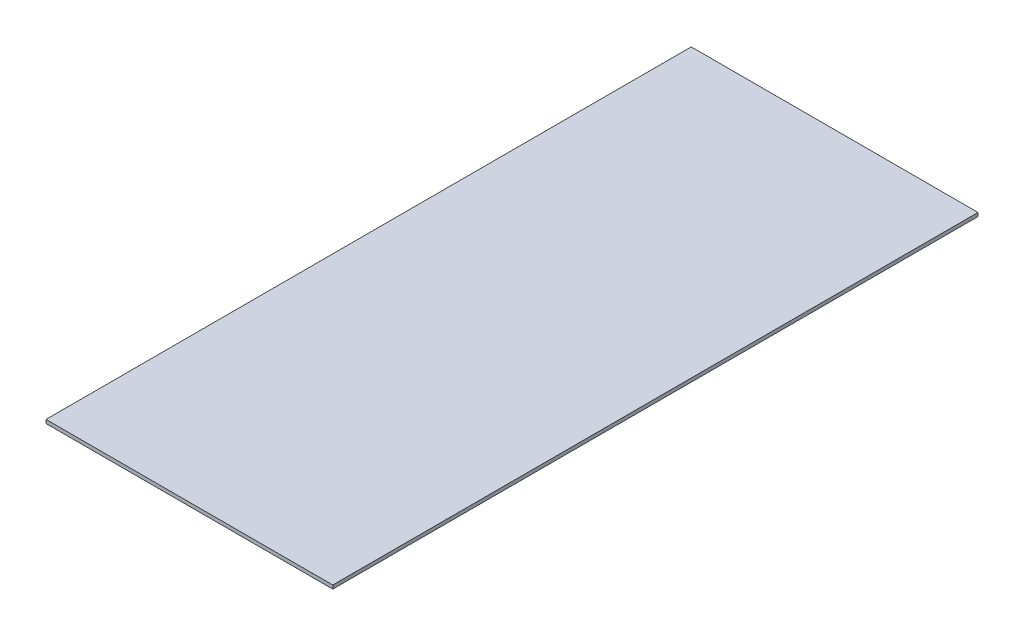
ISO-10303-21;
HEADER;
FILE_DESCRIPTION(('STEP AP214'),'2;1');
FILE_NAME('part.step','',(''),(''),'','','');
FILE_SCHEMA(('AUTOMOTIVE_DESIGN { 1 0 10303 214 1 1 1 1 }'));
ENDSEC;
DATA;
#1=APPLICATION_CONTEXT('core data for automotive mechanical design processes');
#2=APPLICATION_PROTOCOL_DEFINITION('international standard','automotive_design',2000,#1);
#3=PRODUCT_CONTEXT('',#1,'mechanical');
#4=PRODUCT('Part','Part','',(#3));
#5=PRODUCT_RELATED_PRODUCT_CATEGORY('part','',(#4));
#6=PRODUCT_DEFINITION_FORMATION('','',#4);
#7=PRODUCT_DEFINITION_CONTEXT('part definition',#1,'design');
#8=PRODUCT_DEFINITION('design','',#6,#7);
#9=PRODUCT_DEFINITION_SHAPE('','',#8);
#10=(LENGTH_UNIT() NAMED_UNIT(*) SI_UNIT(.MILLI.,.METRE.));
#11=(NAMED_UNIT(*) PLANE_ANGLE_UNIT() SI_UNIT($,.RADIAN.));
#12=(NAMED_UNIT(*) SI_UNIT($,.STERADIAN.) SOLID_ANGLE_UNIT());
#13=UNCERTAINTY_MEASURE_WITH_UNIT(LENGTH_MEASURE(1.E-05),#10,'distance_accuracy_value','');
#14=(GEOMETRIC_REPRESENTATION_CONTEXT(3) GLOBAL_UNCERTAINTY_ASSIGNED_CONTEXT((#13)) GLOBAL_UNIT_ASSIGNED_CONTEXT((#10,
#11,#12)) REPRESENTATION_CONTEXT('',''));
#15=CARTESIAN_POINT('',(0.,0.,0.));
#16=DIRECTION('',(0.,0.,1.));
#17=DIRECTION('',(1.,0.,0.));
#18=AXIS2_PLACEMENT_3D('',#15,#16,#17);
#19=CARTESIAN_POINT('',(254.,6.35,-571.5));
#20=DIRECTION('',(0.,1.,0.));
#21=DIRECTION('',(0.,0.,1.));
#22=AXIS2_PLACEMENT_3D('',#19,#20,#21);
#23=PLANE('',#22);
#24=DIRECTION('',(1.,0.,0.));
#25=VECTOR('',#24,1.);
#26=CARTESIAN_POINT('',(0.,6.35,-571.5));
#27=LINE('',#26,#25);
#28=CARTESIAN_POINT('',(254.,6.35,-571.5));
#29=VERTEX_POINT('',#28);
#30=CARTESIAN_POINT('',(-254.,6.35,-571.5));
#31=VERTEX_POINT('',#30);
#32=EDGE_CURVE('P0_E73',#29,#31,#27,.F.);
#33=ORIENTED_EDGE('',*,*,#32,.T.);
#34=DIRECTION('',(0.,0.,1.));
#35=VECTOR('',#34,1.);
#36=CARTESIAN_POINT('',(-254.,6.35,-571.5));
#37=LINE('',#36,#35);
#38=CARTESIAN_POINT('',(-254.,6.35,571.5));
#39=VERTEX_POINT('',#38);
#40=EDGE_CURVE('P0_E77',#39,#31,#37,.F.);
#41=ORIENTED_EDGE('',*,*,#40,.F.);
#42=DIRECTION('',(1.,0.,0.));
#43=VECTOR('',#42,1.);
#44=CARTESIAN_POINT('',(0.,6.35,571.5));
#45=LINE('',#44,#43);
#46=CARTESIAN_POINT('',(254.,6.35,571.5));
#47=VERTEX_POINT('',#46);
#48=EDGE_CURVE('P0_E104',#47,#39,#45,.F.);
#49=ORIENTED_EDGE('',*,*,#48,.F.);
#50=DIRECTION('',(0.,0.,-1.));
#51=VECTOR('',#50,1.);
#52=CARTESIAN_POINT('',(254.,6.35,-571.5));
#53=LINE('',#52,#51);
#54=EDGE_CURVE('P0_E85',#29,#47,#53,.F.);
#55=ORIENTED_EDGE('',*,*,#54,.F.);
#56=EDGE_LOOP('',(#33,#41,#49,#55));
#57=FACE_BOUND('',#56,.T.);
#58=ADVANCED_FACE('P0_F35',(#57),#23,.T.);
#59=CARTESIAN_POINT('',(0.,0.,-571.5));
#60=DIRECTION('',(0.,0.,1.));
#61=DIRECTION('',(1.,0.,0.));
#62=AXIS2_PLACEMENT_3D('',#59,#60,#61);
#63=PLANE('',#62);
#64=DIRECTION('',(0.,1.,0.));
#65=VECTOR('',#64,1.);
#66=CARTESIAN_POINT('',(-254.,0.,-571.5));
#67=LINE('',#66,#65);
#68=CARTESIAN_POINT('',(-254.,0.,-571.5));
#69=VERTEX_POINT('',#68);
#70=EDGE_CURVE('P0_E79',#31,#69,#67,.F.);
#71=ORIENTED_EDGE('',*,*,#70,.F.);
#72=ORIENTED_EDGE('',*,*,#32,.F.);
#73=DIRECTION('',(0.,1.,0.));
#74=VECTOR('',#73,1.);
#75=CARTESIAN_POINT('',(254.,0.,-571.5));
#76=LINE('',#75,#74);
#77=CARTESIAN_POINT('',(254.,0.,-571.5));
#78=VERTEX_POINT('',#77);
#79=EDGE_CURVE('P0_E90',#78,#29,#76,.T.);
#80=ORIENTED_EDGE('',*,*,#79,.F.);
#81=DIRECTION('',(1.,0.,0.));
#82=VECTOR('',#81,1.);
#83=CARTESIAN_POINT('',(-254.,0.,-571.5));
#84=LINE('',#83,#82);
#85=EDGE_CURVE('P0_E89',#69,#78,#84,.T.);
#86=ORIENTED_EDGE('',*,*,#85,.F.);
#87=EDGE_LOOP('',(#71,#72,#80,#86));
#88=FACE_BOUND('',#87,.T.);
#89=ADVANCED_FACE('P0_F87',(#88),#63,.F.);
#90=CARTESIAN_POINT('',(254.,0.,-571.5));
#91=DIRECTION('',(1.,0.,0.));
#92=DIRECTION('',(0.,0.,-1.));
#93=AXIS2_PLACEMENT_3D('',#90,#91,#92);
#94=PLANE('',#93);
#95=DIRECTION('',(0.,1.,0.));
#96=VECTOR('',#95,1.);
#97=CARTESIAN_POINT('',(254.,0.,571.5));
#98=LINE('',#97,#96);
#99=CARTESIAN_POINT('',(254.,0.,571.5));
#100=VERTEX_POINT('',#99);
#101=EDGE_CURVE('P0_E106',#100,#47,#98,.T.);
#102=ORIENTED_EDGE('',*,*,#101,.F.);
#103=DIRECTION('',(0.,0.,-1.));
#104=VECTOR('',#103,1.);
#105=CARTESIAN_POINT('',(254.,0.,-571.5));
#106=LINE('',#105,#104);
#107=EDGE_CURVE('P0_E44',#78,#100,#106,.F.);
#108=ORIENTED_EDGE('',*,*,#107,.F.);
#109=ORIENTED_EDGE('',*,*,#79,.T.);
#110=ORIENTED_EDGE('',*,*,#54,.T.);
#111=EDGE_LOOP('',(#102,#108,#109,#110));
#112=FACE_BOUND('',#111,.T.);
#113=ADVANCED_FACE('P0_F134',(#112),#94,.T.);
#114=CARTESIAN_POINT('',(0.,0.,571.5));
#115=DIRECTION('',(0.,0.,1.));
#116=DIRECTION('',(1.,0.,0.));
#117=AXIS2_PLACEMENT_3D('',#114,#115,#116);
#118=PLANE('',#117);
#119=ORIENTED_EDGE('',*,*,#48,.T.);
#120=DIRECTION('',(0.,1.,0.));
#121=VECTOR('',#120,1.);
#122=CARTESIAN_POINT('',(-254.,6.35,571.5));
#123=LINE('',#122,#121);
#124=CARTESIAN_POINT('',(-254.,0.,571.5));
#125=VERTEX_POINT('',#124);
#126=EDGE_CURVE('P0_E81',#125,#39,#123,.T.);
#127=ORIENTED_EDGE('',*,*,#126,.F.);
#128=DIRECTION('',(1.,0.,0.));
#129=VECTOR('',#128,1.);
#130=CARTESIAN_POINT('',(-254.,0.,571.5));
#131=LINE('',#130,#129);
#132=EDGE_CURVE('P0_E11',#100,#125,#131,.F.);
#133=ORIENTED_EDGE('',*,*,#132,.F.);
#134=ORIENTED_EDGE('',*,*,#101,.T.);
#135=EDGE_LOOP('',(#119,#127,#133,#134));
#136=FACE_BOUND('',#135,.T.);
#137=ADVANCED_FACE('P0_F129',(#136),#118,.T.);
#138=CARTESIAN_POINT('',(-254.,6.35,-571.5));
#139=DIRECTION('',(-1.,0.,0.));
#140=DIRECTION('',(0.,0.,1.));
#141=AXIS2_PLACEMENT_3D('',#138,#139,#140);
#142=PLANE('',#141);
#143=ORIENTED_EDGE('',*,*,#126,.T.);
#144=ORIENTED_EDGE('',*,*,#40,.T.);
#145=ORIENTED_EDGE('',*,*,#70,.T.);
#146=DIRECTION('',(0.,0.,-1.));
#147=VECTOR('',#146,1.);
#148=CARTESIAN_POINT('',(-254.,0.,-571.5));
#149=LINE('',#148,#147);
#150=EDGE_CURVE('P0_E53',#125,#69,#149,.T.);
#151=ORIENTED_EDGE('',*,*,#150,.F.);
#152=EDGE_LOOP('',(#143,#144,#145,#151));
#153=FACE_BOUND('',#152,.T.);
#154=ADVANCED_FACE('P0_F78',(#153),#142,.T.);
#155=CARTESIAN_POINT('',(-254.,0.,-571.5));
#156=DIRECTION('',(0.,-1.,0.));
#157=DIRECTION('',(0.,0.,-1.));
#158=AXIS2_PLACEMENT_3D('',#155,#156,#157);
#159=PLANE('',#158);
#160=ORIENTED_EDGE('',*,*,#132,.T.);
#161=ORIENTED_EDGE('',*,*,#150,.T.);
#162=ORIENTED_EDGE('',*,*,#85,.T.);
#163=ORIENTED_EDGE('',*,*,#107,.T.);
#164=EDGE_LOOP('',(#160,#161,#162,#163));
#165=FACE_BOUND('',#164,.T.);
#166=ADVANCED_FACE('P0_F127',(#165),#159,.T.);
#167=CLOSED_SHELL('',(#58,#89,#113,#137,#154,#166));
#168=MANIFOLD_SOLID_BREP('P0_B2',#167);
#169=CARTESIAN_POINT('',(-180.975,-1.63080957782746,203.2));
#170=DIRECTION('',(0.,1.,0.));
#171=DIRECTION('',(0.,0.,1.));
#172=AXIS2_PLACEMENT_3D('',#169,#170,#171);
#173=CYLINDRICAL_SURFACE('',#172,3.175);
#174=CARTESIAN_POINT('',(-180.975,0.,203.2));
#175=DIRECTION('',(0.,1.,0.));
#176=DIRECTION('',(0.,0.,1.));
#177=AXIS2_PLACEMENT_3D('',#174,#175,#176);
#178=CIRCLE('',#177,3.175);
#179=CARTESIAN_POINT('',(-180.975,0.,206.375));
#180=VERTEX_POINT('',#179);
#181=EDGE_CURVE('P1_E10',#180,#180,#178,.T.);
#182=ORIENTED_EDGE('',*,*,#181,.T.);
#183=EDGE_LOOP('',(#182));
#184=FACE_BOUND('',#183,.T.);
#185=CARTESIAN_POINT('',(-180.975,2.59531255567134,203.2));
#186=DIRECTION('',(0.,1.,0.));
#187=DIRECTION('',(0.,0.,1.));
#188=AXIS2_PLACEMENT_3D('',#185,#186,#187);
#189=CIRCLE('',#188,3.175);
#190=CARTESIAN_POINT('',(-180.975,2.59531255567134,206.375));
#191=VERTEX_POINT('',#190);
#192=EDGE_CURVE('P1_E19',#191,#191,#189,.F.);
#193=ORIENTED_EDGE('',*,*,#192,.T.);
#194=EDGE_LOOP('',(#193));
#195=FACE_BOUND('',#194,.T.);
#196=ADVANCED_FACE('P1_F14',(#184,#195),#173,.T.);
#197=OPEN_SHELL('',(#196));
#198=SHELL_BASED_SURFACE_MODEL('P1_B1',(#197));
#199=CARTESIAN_POINT('',(-180.975,-1.63080957782746,-241.3));
#200=DIRECTION('',(0.,1.,0.));
#201=DIRECTION('',(0.,0.,1.));
#202=AXIS2_PLACEMENT_3D('',#199,#200,#201);
#203=CYLINDRICAL_SURFACE('',#202,3.175);
#204=CARTESIAN_POINT('',(-180.975,0.,-241.3));
#205=DIRECTION('',(0.,1.,0.));
#206=DIRECTION('',(0.,0.,1.));
#207=AXIS2_PLACEMENT_3D('',#204,#205,#206);
#208=CIRCLE('',#207,3.175);
#209=CARTESIAN_POINT('',(-180.975,0.,-238.125));
#210=VERTEX_POINT('',#209);
#211=EDGE_CURVE('P2_E10',#210,#210,#208,.T.);
#212=ORIENTED_EDGE('',*,*,#211,.T.);
#213=EDGE_LOOP('',(#212));
#214=FACE_BOUND('',#213,.T.);
#215=CARTESIAN_POINT('',(-180.975,2.59531255567134,-241.3));
#216=DIRECTION('',(0.,1.,0.));
#217=DIRECTION('',(0.,0.,1.));
#218=AXIS2_PLACEMENT_3D('',#215,#216,#217);
#219=CIRCLE('',#218,3.175);
#220=CARTESIAN_POINT('',(-180.975,2.59531255567134,-238.125));
#221=VERTEX_POINT('',#220);
#222=EDGE_CURVE('P2_E19',#221,#221,#219,.F.);
#223=ORIENTED_EDGE('',*,*,#222,.T.);
#224=EDGE_LOOP('',(#223));
#225=FACE_BOUND('',#224,.T.);
#226=ADVANCED_FACE('P2_F14',(#214,#225),#203,.T.);
#227=OPEN_SHELL('',(#226));
#228=SHELL_BASED_SURFACE_MODEL('P2_B1',(#227));
#229=CARTESIAN_POINT('',(146.05,-1.63080957782746,530.225));
#230=DIRECTION('',(0.,1.,0.));
#231=DIRECTION('',(0.,0.,1.));
#232=AXIS2_PLACEMENT_3D('',#229,#230,#231);
#233=CYLINDRICAL_SURFACE('',#232,3.175);
#234=CARTESIAN_POINT('',(146.05,0.,530.225));
#235=DIRECTION('',(0.,1.,0.));
#236=DIRECTION('',(0.,0.,1.));
#237=AXIS2_PLACEMENT_3D('',#234,#235,#236);
#238=CIRCLE('',#237,3.175);
#239=CARTESIAN_POINT('',(146.05,0.,533.4));
#240=VERTEX_POINT('',#239);
#241=EDGE_CURVE('P3_E10',#240,#240,#238,.T.);
#242=ORIENTED_EDGE('',*,*,#241,.T.);
#243=EDGE_LOOP('',(#242));
#244=FACE_BOUND('',#243,.T.);
#245=CARTESIAN_POINT('',(146.05,2.59531255567134,530.225));
#246=DIRECTION('',(0.,1.,0.));
#247=DIRECTION('',(0.,0.,1.));
#248=AXIS2_PLACEMENT_3D('',#245,#246,#247);
#249=CIRCLE('',#248,3.175);
#250=CARTESIAN_POINT('',(146.05,2.59531255567134,533.4));
#251=VERTEX_POINT('',#250);
#252=EDGE_CURVE('P3_E19',#251,#251,#249,.F.);
#253=ORIENTED_EDGE('',*,*,#252,.T.);
#254=EDGE_LOOP('',(#253));
#255=FACE_BOUND('',#254,.T.);
#256=ADVANCED_FACE('P3_F14',(#244,#255),#233,.T.);
#257=OPEN_SHELL('',(#256));
#258=SHELL_BASED_SURFACE_MODEL('P3_B1',(#257));
#259=CARTESIAN_POINT('',(146.05,-1.63080957782746,-549.275));
#260=DIRECTION('',(0.,1.,0.));
#261=DIRECTION('',(0.,0.,1.));
#262=AXIS2_PLACEMENT_3D('',#259,#260,#261);
#263=CYLINDRICAL_SURFACE('',#262,3.175);
#264=CARTESIAN_POINT('',(146.05,0.,-549.275));
#265=DIRECTION('',(0.,1.,0.));
#266=DIRECTION('',(0.,0.,1.));
#267=AXIS2_PLACEMENT_3D('',#264,#265,#266);
#268=CIRCLE('',#267,3.175);
#269=CARTESIAN_POINT('',(146.05,0.,-546.1));
#270=VERTEX_POINT('',#269);
#271=EDGE_CURVE('P4_E10',#270,#270,#268,.T.);
#272=ORIENTED_EDGE('',*,*,#271,.T.);
#273=EDGE_LOOP('',(#272));
#274=FACE_BOUND('',#273,.T.);
#275=CARTESIAN_POINT('',(146.05,2.59531255567134,-549.275));
#276=DIRECTION('',(0.,1.,0.));
#277=DIRECTION('',(0.,0.,1.));
#278=AXIS2_PLACEMENT_3D('',#275,#276,#277);
#279=CIRCLE('',#278,3.175);
#280=CARTESIAN_POINT('',(146.05,2.59531255567134,-546.1));
#281=VERTEX_POINT('',#280);
#282=EDGE_CURVE('P4_E19',#281,#281,#279,.F.);
#283=ORIENTED_EDGE('',*,*,#282,.T.);
#284=EDGE_LOOP('',(#283));
#285=FACE_BOUND('',#284,.T.);
#286=ADVANCED_FACE('P4_F14',(#274,#285),#263,.T.);
#287=OPEN_SHELL('',(#286));
#288=SHELL_BASED_SURFACE_MODEL('P4_B1',(#287));
#289=CARTESIAN_POINT('',(-180.975,-1.63080957782746,-342.9));
#290=DIRECTION('',(0.,1.,0.));
#291=DIRECTION('',(0.,0.,1.));
#292=AXIS2_PLACEMENT_3D('',#289,#290,#291);
#293=CYLINDRICAL_SURFACE('',#292,3.175);
#294=CARTESIAN_POINT('',(-180.975,0.,-342.9));
#295=DIRECTION('',(0.,1.,0.));
#296=DIRECTION('',(0.,0.,1.));
#297=AXIS2_PLACEMENT_3D('',#294,#295,#296);
#298=CIRCLE('',#297,3.175);
#299=CARTESIAN_POINT('',(-180.975,0.,-339.725));
#300=VERTEX_POINT('',#299);
#301=EDGE_CURVE('P5_E10',#300,#300,#298,.T.);
#302=ORIENTED_EDGE('',*,*,#301,.T.);
#303=EDGE_LOOP('',(#302));
#304=FACE_BOUND('',#303,.T.);
#305=CARTESIAN_POINT('',(-180.975,2.59531255567134,-342.9));
#306=DIRECTION('',(0.,1.,0.));
#307=DIRECTION('',(0.,0.,1.));
#308=AXIS2_PLACEMENT_3D('',#305,#306,#307);
#309=CIRCLE('',#308,3.175);
#310=CARTESIAN_POINT('',(-180.975,2.59531255567134,-339.725));
#311=VERTEX_POINT('',#310);
#312=EDGE_CURVE('P5_E19',#311,#311,#309,.F.);
#313=ORIENTED_EDGE('',*,*,#312,.T.);
#314=EDGE_LOOP('',(#313));
#315=FACE_BOUND('',#314,.T.);
#316=ADVANCED_FACE('P5_F14',(#304,#315),#293,.T.);
#317=OPEN_SHELL('',(#316));
#318=SHELL_BASED_SURFACE_MODEL('P5_B1',(#317));
#319=CARTESIAN_POINT('',(-180.975,-1.63080957782746,304.8));
#320=DIRECTION('',(0.,1.,0.));
#321=DIRECTION('',(0.,0.,1.));
#322=AXIS2_PLACEMENT_3D('',#319,#320,#321);
#323=CYLINDRICAL_SURFACE('',#322,3.175);
#324=CARTESIAN_POINT('',(-180.975,0.,304.8));
#325=DIRECTION('',(0.,1.,0.));
#326=DIRECTION('',(0.,0.,1.));
#327=AXIS2_PLACEMENT_3D('',#324,#325,#326);
#328=CIRCLE('',#327,3.175);
#329=CARTESIAN_POINT('',(-180.975,0.,307.975));
#330=VERTEX_POINT('',#329);
#331=EDGE_CURVE('P6_E10',#330,#330,#328,.T.);
#332=ORIENTED_EDGE('',*,*,#331,.T.);
#333=EDGE_LOOP('',(#332));
#334=FACE_BOUND('',#333,.T.);
#335=CARTESIAN_POINT('',(-180.975,2.59531255567134,304.8));
#336=DIRECTION('',(0.,1.,0.));
#337=DIRECTION('',(0.,0.,1.));
#338=AXIS2_PLACEMENT_3D('',#335,#336,#337);
#339=CIRCLE('',#338,3.175);
#340=CARTESIAN_POINT('',(-180.975,2.59531255567134,307.975));
#341=VERTEX_POINT('',#340);
#342=EDGE_CURVE('P6_E19',#341,#341,#339,.F.);
#343=ORIENTED_EDGE('',*,*,#342,.T.);
#344=EDGE_LOOP('',(#343));
#345=FACE_BOUND('',#344,.T.);
#346=ADVANCED_FACE('P6_F14',(#334,#345),#323,.T.);
#347=OPEN_SHELL('',(#346));
#348=SHELL_BASED_SURFACE_MODEL('P6_B1',(#347));
#349=CARTESIAN_POINT('',(165.1,-1.63080957782746,549.275));
#350=DIRECTION('',(0.,1.,0.));
#351=DIRECTION('',(0.,0.,1.));
#352=AXIS2_PLACEMENT_3D('',#349,#350,#351);
#353=CYLINDRICAL_SURFACE('',#352,3.175);
#354=CARTESIAN_POINT('',(165.1,0.,549.275));
#355=DIRECTION('',(0.,1.,0.));
#356=DIRECTION('',(0.,0.,1.));
#357=AXIS2_PLACEMENT_3D('',#354,#355,#356);
#358=CIRCLE('',#357,3.175);
#359=CARTESIAN_POINT('',(165.1,0.,552.45));
#360=VERTEX_POINT('',#359);
#361=EDGE_CURVE('P7_E10',#360,#360,#358,.T.);
#362=ORIENTED_EDGE('',*,*,#361,.T.);
#363=EDGE_LOOP('',(#362));
#364=FACE_BOUND('',#363,.T.);
#365=CARTESIAN_POINT('',(165.1,2.59531255567134,549.275));
#366=DIRECTION('',(0.,1.,0.));
#367=DIRECTION('',(0.,0.,1.));
#368=AXIS2_PLACEMENT_3D('',#365,#366,#367);
#369=CIRCLE('',#368,3.175);
#370=CARTESIAN_POINT('',(165.1,2.59531255567134,552.45));
#371=VERTEX_POINT('',#370);
#372=EDGE_CURVE('P7_E19',#371,#371,#369,.F.);
#373=ORIENTED_EDGE('',*,*,#372,.T.);
#374=EDGE_LOOP('',(#373));
#375=FACE_BOUND('',#374,.T.);
#376=ADVANCED_FACE('P7_F14',(#364,#375),#353,.T.);
#377=OPEN_SHELL('',(#376));
#378=SHELL_BASED_SURFACE_MODEL('P7_B1',(#377));
#379=CARTESIAN_POINT('',(165.1,-1.63080957782746,-530.225));
#380=DIRECTION('',(0.,1.,0.));
#381=DIRECTION('',(0.,0.,1.));
#382=AXIS2_PLACEMENT_3D('',#379,#380,#381);
#383=CYLINDRICAL_SURFACE('',#382,3.175);
#384=CARTESIAN_POINT('',(165.1,0.,-530.225));
#385=DIRECTION('',(0.,1.,0.));
#386=DIRECTION('',(0.,0.,1.));
#387=AXIS2_PLACEMENT_3D('',#384,#385,#386);
#388=CIRCLE('',#387,3.175);
#389=CARTESIAN_POINT('',(165.1,0.,-527.05));
#390=VERTEX_POINT('',#389);
#391=EDGE_CURVE('P8_E10',#390,#390,#388,.T.);
#392=ORIENTED_EDGE('',*,*,#391,.T.);
#393=EDGE_LOOP('',(#392));
#394=FACE_BOUND('',#393,.T.);
#395=CARTESIAN_POINT('',(165.1,2.59531255567134,-530.225));
#396=DIRECTION('',(0.,1.,0.));
#397=DIRECTION('',(0.,0.,1.));
#398=AXIS2_PLACEMENT_3D('',#395,#396,#397);
#399=CIRCLE('',#398,3.175);
#400=CARTESIAN_POINT('',(165.1,2.59531255567134,-527.05));
#401=VERTEX_POINT('',#400);
#402=EDGE_CURVE('P8_E19',#401,#401,#399,.F.);
#403=ORIENTED_EDGE('',*,*,#402,.T.);
#404=EDGE_LOOP('',(#403));
#405=FACE_BOUND('',#404,.T.);
#406=ADVANCED_FACE('P8_F14',(#394,#405),#383,.T.);
#407=OPEN_SHELL('',(#406));
#408=SHELL_BASED_SURFACE_MODEL('P8_B1',(#407));
#409=ADVANCED_BREP_SHAPE_REPRESENTATION('',(#18,#168),#14);
#410=MANIFOLD_SURFACE_SHAPE_REPRESENTATION('',(#18,#198,#228,#258,#288,#318,#348,#378,#408),#14);
#411=SHAPE_REPRESENTATION('',(#18),#14);
#412=SHAPE_DEFINITION_REPRESENTATION(#9,#411);
#413=SHAPE_REPRESENTATION_RELATIONSHIP('','',#411,#409);
#414=SHAPE_REPRESENTATION_RELATIONSHIP('','',#411,#410);
ENDSEC;
END-ISO-10303-21;
